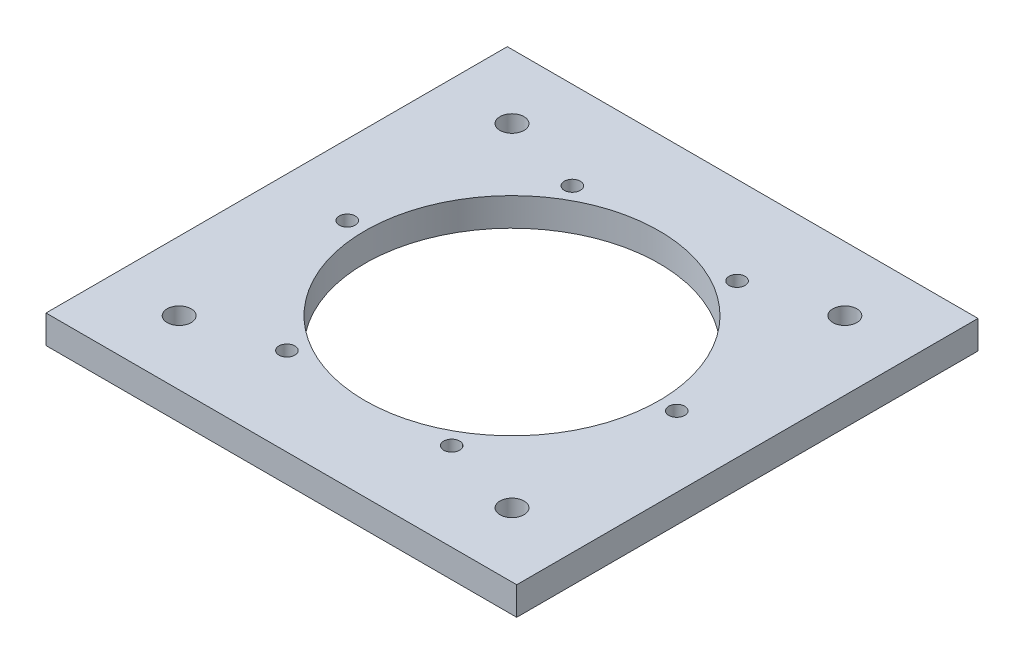
ISO-10303-21;
HEADER;
FILE_DESCRIPTION(('STEP AP214'),'2;1');
FILE_NAME('part.step','',(''),(''),'','','');
FILE_SCHEMA(('AUTOMOTIVE_DESIGN { 1 0 10303 214 1 1 1 1 }'));
ENDSEC;
DATA;
#1=APPLICATION_CONTEXT('core data for automotive mechanical design processes');
#2=APPLICATION_PROTOCOL_DEFINITION('international standard','automotive_design',2000,#1);
#3=PRODUCT_CONTEXT('',#1,'mechanical');
#4=PRODUCT('Part','Part','',(#3));
#5=PRODUCT_RELATED_PRODUCT_CATEGORY('part','',(#4));
#6=PRODUCT_DEFINITION_FORMATION('','',#4);
#7=PRODUCT_DEFINITION_CONTEXT('part definition',#1,'design');
#8=PRODUCT_DEFINITION('design','',#6,#7);
#9=PRODUCT_DEFINITION_SHAPE('','',#8);
#10=(LENGTH_UNIT() NAMED_UNIT(*) SI_UNIT(.MILLI.,.METRE.));
#11=(NAMED_UNIT(*) PLANE_ANGLE_UNIT() SI_UNIT($,.RADIAN.));
#12=(NAMED_UNIT(*) SI_UNIT($,.STERADIAN.) SOLID_ANGLE_UNIT());
#13=UNCERTAINTY_MEASURE_WITH_UNIT(LENGTH_MEASURE(1.E-05),#10,'distance_accuracy_value','');
#14=(GEOMETRIC_REPRESENTATION_CONTEXT(3) GLOBAL_UNCERTAINTY_ASSIGNED_CONTEXT((#13)) GLOBAL_UNIT_ASSIGNED_CONTEXT((#10,
#11,#12)) REPRESENTATION_CONTEXT('',''));
#15=CARTESIAN_POINT('',(0.,0.,0.));
#16=DIRECTION('',(0.,0.,1.));
#17=DIRECTION('',(1.,0.,0.));
#18=AXIS2_PLACEMENT_3D('',#15,#16,#17);
#19=CARTESIAN_POINT('',(0.,12.,0.));
#20=DIRECTION('',(0.,-1.,0.));
#21=DIRECTION('',(0.,0.,-1.));
#22=AXIS2_PLACEMENT_3D('',#19,#20,#21);
#23=PLANE('',#22);
#24=CARTESIAN_POINT('',(70.7106781186555,12.,70.710678118654));
#25=DIRECTION('',(0.,1.,0.));
#26=DIRECTION('',(0.,0.,1.));
#27=AXIS2_PLACEMENT_3D('',#24,#25,#26);
#28=CIRCLE('',#27,5.1);
#29=CARTESIAN_POINT('',(70.7106781186555,12.,75.810678118654));
#30=VERTEX_POINT('',#29);
#31=EDGE_CURVE('E20',#30,#30,#28,.F.);
#32=ORIENTED_EDGE('',*,*,#31,.T.);
#33=EDGE_LOOP('',(#32));
#34=FACE_BOUND('',#33,.T.);
#35=CARTESIAN_POINT('',(35.,12.,60.6217782649106));
#36=DIRECTION('',(0.,1.,0.));
#37=DIRECTION('',(0.,0.,1.));
#38=AXIS2_PLACEMENT_3D('',#35,#36,#37);
#39=CIRCLE('',#38,3.4);
#40=CARTESIAN_POINT('',(35.,12.,64.0217782649106));
#41=VERTEX_POINT('',#40);
#42=EDGE_CURVE('E126',#41,#41,#39,.F.);
#43=ORIENTED_EDGE('',*,*,#42,.T.);
#44=EDGE_LOOP('',(#43));
#45=FACE_BOUND('',#44,.T.);
#46=DIRECTION('',(1.,0.,0.));
#47=VECTOR('',#46,1.);
#48=CARTESIAN_POINT('',(-100.,12.,-98.));
#49=LINE('',#48,#47);
#50=CARTESIAN_POINT('',(100.,12.,-98.));
#51=VERTEX_POINT('',#50);
#52=CARTESIAN_POINT('',(-100.,12.,-98.));
#53=VERTEX_POINT('',#52);
#54=EDGE_CURVE('E370',#51,#53,#49,.F.);
#55=ORIENTED_EDGE('',*,*,#54,.T.);
#56=DIRECTION('',(0.,0.,-1.));
#57=VECTOR('',#56,1.);
#58=CARTESIAN_POINT('',(-100.,12.,98.));
#59=LINE('',#58,#57);
#60=CARTESIAN_POINT('',(-100.,12.,98.));
#61=VERTEX_POINT('',#60);
#62=EDGE_CURVE('E55',#53,#61,#59,.F.);
#63=ORIENTED_EDGE('',*,*,#62,.T.);
#64=DIRECTION('',(-1.,0.,0.));
#65=VECTOR('',#64,1.);
#66=CARTESIAN_POINT('',(-100.,12.,98.));
#67=LINE('',#66,#65);
#68=CARTESIAN_POINT('',(100.,12.,98.));
#69=VERTEX_POINT('',#68);
#70=EDGE_CURVE('E57',#61,#69,#67,.F.);
#71=ORIENTED_EDGE('',*,*,#70,.T.);
#72=DIRECTION('',(0.,0.,1.));
#73=VECTOR('',#72,1.);
#74=CARTESIAN_POINT('',(100.,12.,98.));
#75=LINE('',#74,#73);
#76=EDGE_CURVE('E60',#69,#51,#75,.F.);
#77=ORIENTED_EDGE('',*,*,#76,.T.);
#78=EDGE_LOOP('',(#55,#63,#71,#77));
#79=FACE_BOUND('',#78,.T.);
#80=CARTESIAN_POINT('',(0.,12.,0.));
#81=DIRECTION('',(0.,1.,0.));
#82=DIRECTION('',(0.,0.,1.));
#83=AXIS2_PLACEMENT_3D('',#80,#81,#82);
#84=CIRCLE('',#83,62.5);
#85=CARTESIAN_POINT('',(0.,12.,62.5));
#86=VERTEX_POINT('',#85);
#87=EDGE_CURVE('E73',#86,#86,#84,.F.);
#88=ORIENTED_EDGE('',*,*,#87,.T.);
#89=EDGE_LOOP('',(#88));
#90=FACE_BOUND('',#89,.T.);
#91=CARTESIAN_POINT('',(-70.,12.,0.));
#92=DIRECTION('',(0.,1.,0.));
#93=DIRECTION('',(0.,0.,1.));
#94=AXIS2_PLACEMENT_3D('',#91,#92,#93);
#95=CIRCLE('',#94,3.4);
#96=CARTESIAN_POINT('',(-70.,12.,3.40000000000001));
#97=VERTEX_POINT('',#96);
#98=EDGE_CURVE('E120',#97,#97,#95,.F.);
#99=ORIENTED_EDGE('',*,*,#98,.T.);
#100=EDGE_LOOP('',(#99));
#101=FACE_BOUND('',#100,.T.);
#102=CARTESIAN_POINT('',(-35.,12.,60.6217782649108));
#103=DIRECTION('',(0.,1.,0.));
#104=DIRECTION('',(0.,0.,1.));
#105=AXIS2_PLACEMENT_3D('',#102,#103,#104);
#106=CIRCLE('',#105,3.4);
#107=CARTESIAN_POINT('',(-35.,12.,64.0217782649108));
#108=VERTEX_POINT('',#107);
#109=EDGE_CURVE('E123',#108,#108,#106,.F.);
#110=ORIENTED_EDGE('',*,*,#109,.T.);
#111=EDGE_LOOP('',(#110));
#112=FACE_BOUND('',#111,.T.);
#113=CARTESIAN_POINT('',(70.,12.,0.));
#114=DIRECTION('',(0.,1.,0.));
#115=DIRECTION('',(0.,0.,1.));
#116=AXIS2_PLACEMENT_3D('',#113,#114,#115);
#117=CIRCLE('',#116,3.4);
#118=CARTESIAN_POINT('',(70.,12.,3.39999999999999));
#119=VERTEX_POINT('',#118);
#120=EDGE_CURVE('E129',#119,#119,#117,.F.);
#121=ORIENTED_EDGE('',*,*,#120,.T.);
#122=EDGE_LOOP('',(#121));
#123=FACE_BOUND('',#122,.T.);
#124=CARTESIAN_POINT('',(34.9999999999995,12.,-60.621778264911));
#125=DIRECTION('',(0.,1.,0.));
#126=DIRECTION('',(0.,0.,1.));
#127=AXIS2_PLACEMENT_3D('',#124,#125,#126);
#128=CIRCLE('',#127,3.4);
#129=CARTESIAN_POINT('',(34.9999999999995,12.,-57.221778264911));
#130=VERTEX_POINT('',#129);
#131=EDGE_CURVE('E132',#130,#130,#128,.F.);
#132=ORIENTED_EDGE('',*,*,#131,.T.);
#133=EDGE_LOOP('',(#132));
#134=FACE_BOUND('',#133,.T.);
#135=CARTESIAN_POINT('',(-35.0000000000007,12.,-60.6217782649103));
#136=DIRECTION('',(0.,1.,0.));
#137=DIRECTION('',(0.,0.,1.));
#138=AXIS2_PLACEMENT_3D('',#135,#136,#137);
#139=CIRCLE('',#138,3.4);
#140=CARTESIAN_POINT('',(-35.0000000000007,12.,-57.2217782649103));
#141=VERTEX_POINT('',#140);
#142=EDGE_CURVE('E135',#141,#141,#139,.F.);
#143=ORIENTED_EDGE('',*,*,#142,.T.);
#144=EDGE_LOOP('',(#143));
#145=FACE_BOUND('',#144,.T.);
#146=CARTESIAN_POINT('',(70.7106781186547,12.,-70.7106781186548));
#147=DIRECTION('',(0.,1.,0.));
#148=DIRECTION('',(0.,0.,1.));
#149=AXIS2_PLACEMENT_3D('',#146,#147,#148);
#150=CIRCLE('',#149,5.1);
#151=CARTESIAN_POINT('',(70.7106781186547,12.,-65.6106781186548));
#152=VERTEX_POINT('',#151);
#153=EDGE_CURVE('E138',#152,#152,#150,.F.);
#154=ORIENTED_EDGE('',*,*,#153,.T.);
#155=EDGE_LOOP('',(#154));
#156=FACE_BOUND('',#155,.T.);
#157=CARTESIAN_POINT('',(-70.710678118655,12.,-70.7106781186545));
#158=DIRECTION('',(0.,1.,0.));
#159=DIRECTION('',(0.,0.,1.));
#160=AXIS2_PLACEMENT_3D('',#157,#158,#159);
#161=CIRCLE('',#160,5.1);
#162=CARTESIAN_POINT('',(-70.710678118655,12.,-65.6106781186545));
#163=VERTEX_POINT('',#162);
#164=EDGE_CURVE('E141',#163,#163,#161,.F.);
#165=ORIENTED_EDGE('',*,*,#164,.T.);
#166=EDGE_LOOP('',(#165));
#167=FACE_BOUND('',#166,.T.);
#168=CARTESIAN_POINT('',(-70.7106781186547,12.,70.7106781186548));
#169=DIRECTION('',(0.,1.,0.));
#170=DIRECTION('',(0.,0.,1.));
#171=AXIS2_PLACEMENT_3D('',#168,#169,#170);
#172=CIRCLE('',#171,5.1);
#173=CARTESIAN_POINT('',(-70.7106781186547,12.,75.8106781186548));
#174=VERTEX_POINT('',#173);
#175=EDGE_CURVE('E143',#174,#174,#172,.F.);
#176=ORIENTED_EDGE('',*,*,#175,.T.);
#177=EDGE_LOOP('',(#176));
#178=FACE_BOUND('',#177,.T.);
#179=ADVANCED_FACE('F17',(#34,#45,#79,#90,#101,#112,#123,#134,#145,#156,#167,#178),#23,.F.);
#180=CARTESIAN_POINT('',(70.7106781186555,12.,70.710678118654));
#181=DIRECTION('',(0.,1.,0.));
#182=DIRECTION('',(0.,0.,1.));
#183=AXIS2_PLACEMENT_3D('',#180,#181,#182);
#184=CYLINDRICAL_SURFACE('',#183,5.1);
#185=CARTESIAN_POINT('',(70.7106781186555,0.,70.710678118654));
#186=DIRECTION('',(0.,1.,0.));
#187=DIRECTION('',(0.,0.,1.));
#188=AXIS2_PLACEMENT_3D('',#185,#186,#187);
#189=CIRCLE('',#188,5.1);
#190=CARTESIAN_POINT('',(70.7106781186555,0.,75.810678118654));
#191=VERTEX_POINT('',#190);
#192=EDGE_CURVE('E115',#191,#191,#189,.T.);
#193=ORIENTED_EDGE('',*,*,#192,.F.);
#194=EDGE_LOOP('',(#193));
#195=FACE_BOUND('',#194,.T.);
#196=ORIENTED_EDGE('',*,*,#31,.F.);
#197=EDGE_LOOP('',(#196));
#198=FACE_BOUND('',#197,.T.);
#199=ADVANCED_FACE('F152',(#195,#198),#184,.F.);
#200=CARTESIAN_POINT('',(-70.7106781186547,12.,70.7106781186548));
#201=DIRECTION('',(0.,1.,0.));
#202=DIRECTION('',(0.,0.,1.));
#203=AXIS2_PLACEMENT_3D('',#200,#201,#202);
#204=CYLINDRICAL_SURFACE('',#203,5.1);
#205=CARTESIAN_POINT('',(-70.7106781186547,0.,70.7106781186548));
#206=DIRECTION('',(0.,1.,0.));
#207=DIRECTION('',(0.,0.,1.));
#208=AXIS2_PLACEMENT_3D('',#205,#206,#207);
#209=CIRCLE('',#208,5.1);
#210=CARTESIAN_POINT('',(-70.7106781186547,0.,75.8106781186548));
#211=VERTEX_POINT('',#210);
#212=EDGE_CURVE('E112',#211,#211,#209,.T.);
#213=ORIENTED_EDGE('',*,*,#212,.F.);
#214=EDGE_LOOP('',(#213));
#215=FACE_BOUND('',#214,.T.);
#216=ORIENTED_EDGE('',*,*,#175,.F.);
#217=EDGE_LOOP('',(#216));
#218=FACE_BOUND('',#217,.T.);
#219=ADVANCED_FACE('F154',(#215,#218),#204,.F.);
#220=CARTESIAN_POINT('',(-70.710678118655,12.,-70.7106781186545));
#221=DIRECTION('',(0.,1.,0.));
#222=DIRECTION('',(0.,0.,1.));
#223=AXIS2_PLACEMENT_3D('',#220,#221,#222);
#224=CYLINDRICAL_SURFACE('',#223,5.1);
#225=CARTESIAN_POINT('',(-70.710678118655,0.,-70.7106781186545));
#226=DIRECTION('',(0.,1.,0.));
#227=DIRECTION('',(0.,0.,1.));
#228=AXIS2_PLACEMENT_3D('',#225,#226,#227);
#229=CIRCLE('',#228,5.1);
#230=CARTESIAN_POINT('',(-70.710678118655,0.,-65.6106781186545));
#231=VERTEX_POINT('',#230);
#232=EDGE_CURVE('E109',#231,#231,#229,.T.);
#233=ORIENTED_EDGE('',*,*,#232,.F.);
#234=EDGE_LOOP('',(#233));
#235=FACE_BOUND('',#234,.T.);
#236=ORIENTED_EDGE('',*,*,#164,.F.);
#237=EDGE_LOOP('',(#236));
#238=FACE_BOUND('',#237,.T.);
#239=ADVANCED_FACE('F162',(#235,#238),#224,.F.);
#240=CARTESIAN_POINT('',(70.7106781186547,12.,-70.7106781186548));
#241=DIRECTION('',(0.,1.,0.));
#242=DIRECTION('',(0.,0.,1.));
#243=AXIS2_PLACEMENT_3D('',#240,#241,#242);
#244=CYLINDRICAL_SURFACE('',#243,5.1);
#245=CARTESIAN_POINT('',(70.7106781186547,0.,-70.7106781186548));
#246=DIRECTION('',(0.,1.,0.));
#247=DIRECTION('',(0.,0.,1.));
#248=AXIS2_PLACEMENT_3D('',#245,#246,#247);
#249=CIRCLE('',#248,5.1);
#250=CARTESIAN_POINT('',(70.7106781186547,0.,-65.6106781186548));
#251=VERTEX_POINT('',#250);
#252=EDGE_CURVE('E106',#251,#251,#249,.T.);
#253=ORIENTED_EDGE('',*,*,#252,.F.);
#254=EDGE_LOOP('',(#253));
#255=FACE_BOUND('',#254,.T.);
#256=ORIENTED_EDGE('',*,*,#153,.F.);
#257=EDGE_LOOP('',(#256));
#258=FACE_BOUND('',#257,.T.);
#259=ADVANCED_FACE('F214',(#255,#258),#244,.F.);
#260=CARTESIAN_POINT('',(-35.0000000000007,12.,-60.6217782649103));
#261=DIRECTION('',(0.,1.,0.));
#262=DIRECTION('',(0.,0.,1.));
#263=AXIS2_PLACEMENT_3D('',#260,#261,#262);
#264=CYLINDRICAL_SURFACE('',#263,3.4);
#265=CARTESIAN_POINT('',(-35.0000000000007,0.,-60.6217782649103));
#266=DIRECTION('',(0.,1.,0.));
#267=DIRECTION('',(0.,0.,1.));
#268=AXIS2_PLACEMENT_3D('',#265,#266,#267);
#269=CIRCLE('',#268,3.4);
#270=CARTESIAN_POINT('',(-35.0000000000007,0.,-57.2217782649103));
#271=VERTEX_POINT('',#270);
#272=EDGE_CURVE('E103',#271,#271,#269,.T.);
#273=ORIENTED_EDGE('',*,*,#272,.F.);
#274=EDGE_LOOP('',(#273));
#275=FACE_BOUND('',#274,.T.);
#276=ORIENTED_EDGE('',*,*,#142,.F.);
#277=EDGE_LOOP('',(#276));
#278=FACE_BOUND('',#277,.T.);
#279=ADVANCED_FACE('F210',(#275,#278),#264,.F.);
#280=CARTESIAN_POINT('',(34.9999999999995,12.,-60.621778264911));
#281=DIRECTION('',(0.,1.,0.));
#282=DIRECTION('',(0.,0.,1.));
#283=AXIS2_PLACEMENT_3D('',#280,#281,#282);
#284=CYLINDRICAL_SURFACE('',#283,3.4);
#285=CARTESIAN_POINT('',(34.9999999999995,0.,-60.621778264911));
#286=DIRECTION('',(0.,1.,0.));
#287=DIRECTION('',(0.,0.,1.));
#288=AXIS2_PLACEMENT_3D('',#285,#286,#287);
#289=CIRCLE('',#288,3.4);
#290=CARTESIAN_POINT('',(34.9999999999995,0.,-57.221778264911));
#291=VERTEX_POINT('',#290);
#292=EDGE_CURVE('E100',#291,#291,#289,.T.);
#293=ORIENTED_EDGE('',*,*,#292,.F.);
#294=EDGE_LOOP('',(#293));
#295=FACE_BOUND('',#294,.T.);
#296=ORIENTED_EDGE('',*,*,#131,.F.);
#297=EDGE_LOOP('',(#296));
#298=FACE_BOUND('',#297,.T.);
#299=ADVANCED_FACE('F206',(#295,#298),#284,.F.);
#300=CARTESIAN_POINT('',(70.,12.,0.));
#301=DIRECTION('',(0.,1.,0.));
#302=DIRECTION('',(0.,0.,1.));
#303=AXIS2_PLACEMENT_3D('',#300,#301,#302);
#304=CYLINDRICAL_SURFACE('',#303,3.4);
#305=CARTESIAN_POINT('',(70.,0.,0.));
#306=DIRECTION('',(0.,1.,0.));
#307=DIRECTION('',(0.,0.,1.));
#308=AXIS2_PLACEMENT_3D('',#305,#306,#307);
#309=CIRCLE('',#308,3.4);
#310=CARTESIAN_POINT('',(70.,0.,3.39999999999999));
#311=VERTEX_POINT('',#310);
#312=EDGE_CURVE('E97',#311,#311,#309,.T.);
#313=ORIENTED_EDGE('',*,*,#312,.F.);
#314=EDGE_LOOP('',(#313));
#315=FACE_BOUND('',#314,.T.);
#316=ORIENTED_EDGE('',*,*,#120,.F.);
#317=EDGE_LOOP('',(#316));
#318=FACE_BOUND('',#317,.T.);
#319=ADVANCED_FACE('F202',(#315,#318),#304,.F.);
#320=CARTESIAN_POINT('',(35.,12.,60.6217782649106));
#321=DIRECTION('',(0.,1.,0.));
#322=DIRECTION('',(0.,0.,1.));
#323=AXIS2_PLACEMENT_3D('',#320,#321,#322);
#324=CYLINDRICAL_SURFACE('',#323,3.4);
#325=CARTESIAN_POINT('',(35.,0.,60.6217782649106));
#326=DIRECTION('',(0.,1.,0.));
#327=DIRECTION('',(0.,0.,1.));
#328=AXIS2_PLACEMENT_3D('',#325,#326,#327);
#329=CIRCLE('',#328,3.4);
#330=CARTESIAN_POINT('',(35.,0.,64.0217782649106));
#331=VERTEX_POINT('',#330);
#332=EDGE_CURVE('E94',#331,#331,#329,.T.);
#333=ORIENTED_EDGE('',*,*,#332,.F.);
#334=EDGE_LOOP('',(#333));
#335=FACE_BOUND('',#334,.T.);
#336=ORIENTED_EDGE('',*,*,#42,.F.);
#337=EDGE_LOOP('',(#336));
#338=FACE_BOUND('',#337,.T.);
#339=ADVANCED_FACE('F198',(#335,#338),#324,.F.);
#340=CARTESIAN_POINT('',(-35.,12.,60.6217782649108));
#341=DIRECTION('',(0.,1.,0.));
#342=DIRECTION('',(0.,0.,1.));
#343=AXIS2_PLACEMENT_3D('',#340,#341,#342);
#344=CYLINDRICAL_SURFACE('',#343,3.4);
#345=CARTESIAN_POINT('',(-35.,0.,60.6217782649108));
#346=DIRECTION('',(0.,1.,0.));
#347=DIRECTION('',(0.,0.,1.));
#348=AXIS2_PLACEMENT_3D('',#345,#346,#347);
#349=CIRCLE('',#348,3.4);
#350=CARTESIAN_POINT('',(-35.,0.,64.0217782649108));
#351=VERTEX_POINT('',#350);
#352=EDGE_CURVE('E91',#351,#351,#349,.T.);
#353=ORIENTED_EDGE('',*,*,#352,.F.);
#354=EDGE_LOOP('',(#353));
#355=FACE_BOUND('',#354,.T.);
#356=ORIENTED_EDGE('',*,*,#109,.F.);
#357=EDGE_LOOP('',(#356));
#358=FACE_BOUND('',#357,.T.);
#359=ADVANCED_FACE('F194',(#355,#358),#344,.F.);
#360=CARTESIAN_POINT('',(-70.,12.,0.));
#361=DIRECTION('',(0.,1.,0.));
#362=DIRECTION('',(0.,0.,1.));
#363=AXIS2_PLACEMENT_3D('',#360,#361,#362);
#364=CYLINDRICAL_SURFACE('',#363,3.4);
#365=CARTESIAN_POINT('',(-70.,0.,0.));
#366=DIRECTION('',(0.,1.,0.));
#367=DIRECTION('',(0.,0.,1.));
#368=AXIS2_PLACEMENT_3D('',#365,#366,#367);
#369=CIRCLE('',#368,3.4);
#370=CARTESIAN_POINT('',(-70.,0.,3.40000000000001));
#371=VERTEX_POINT('',#370);
#372=EDGE_CURVE('E88',#371,#371,#369,.T.);
#373=ORIENTED_EDGE('',*,*,#372,.F.);
#374=EDGE_LOOP('',(#373));
#375=FACE_BOUND('',#374,.T.);
#376=ORIENTED_EDGE('',*,*,#98,.F.);
#377=EDGE_LOOP('',(#376));
#378=FACE_BOUND('',#377,.T.);
#379=ADVANCED_FACE('F190',(#375,#378),#364,.F.);
#380=CARTESIAN_POINT('',(0.,0.,0.));
#381=DIRECTION('',(0.,1.,0.));
#382=DIRECTION('',(0.,0.,1.));
#383=AXIS2_PLACEMENT_3D('',#380,#381,#382);
#384=CYLINDRICAL_SURFACE('',#383,62.5);
#385=ORIENTED_EDGE('',*,*,#87,.F.);
#386=EDGE_LOOP('',(#385));
#387=FACE_BOUND('',#386,.T.);
#388=CARTESIAN_POINT('',(0.,0.,0.));
#389=DIRECTION('',(0.,1.,0.));
#390=DIRECTION('',(0.,0.,1.));
#391=AXIS2_PLACEMENT_3D('',#388,#389,#390);
#392=CIRCLE('',#391,62.5);
#393=CARTESIAN_POINT('',(0.,0.,62.5));
#394=VERTEX_POINT('',#393);
#395=EDGE_CURVE('E84',#394,#394,#392,.T.);
#396=ORIENTED_EDGE('',*,*,#395,.F.);
#397=EDGE_LOOP('',(#396));
#398=FACE_BOUND('',#397,.T.);
#399=ADVANCED_FACE('F187',(#387,#398),#384,.F.);
#400=CARTESIAN_POINT('',(100.,12.,98.));
#401=DIRECTION('',(-1.,0.,0.));
#402=DIRECTION('',(0.,0.,1.));
#403=AXIS2_PLACEMENT_3D('',#400,#401,#402);
#404=PLANE('',#403);
#405=DIRECTION('',(0.,1.,0.));
#406=VECTOR('',#405,1.);
#407=CARTESIAN_POINT('',(100.,12.,-98.));
#408=LINE('',#407,#406);
#409=CARTESIAN_POINT('',(100.,0.,-98.));
#410=VERTEX_POINT('',#409);
#411=EDGE_CURVE('E71',#410,#51,#408,.T.);
#412=ORIENTED_EDGE('',*,*,#411,.T.);
#413=ORIENTED_EDGE('',*,*,#76,.F.);
#414=DIRECTION('',(0.,1.,0.));
#415=VECTOR('',#414,1.);
#416=CARTESIAN_POINT('',(100.,12.,98.));
#417=LINE('',#416,#415);
#418=CARTESIAN_POINT('',(100.,0.,98.));
#419=VERTEX_POINT('',#418);
#420=EDGE_CURVE('E65',#69,#419,#417,.F.);
#421=ORIENTED_EDGE('',*,*,#420,.T.);
#422=DIRECTION('',(0.,0.,-1.));
#423=VECTOR('',#422,1.);
#424=CARTESIAN_POINT('',(100.,0.,0.));
#425=LINE('',#424,#423);
#426=EDGE_CURVE('E87',#410,#419,#425,.F.);
#427=ORIENTED_EDGE('',*,*,#426,.F.);
#428=EDGE_LOOP('',(#412,#413,#421,#427));
#429=FACE_BOUND('',#428,.T.);
#430=ADVANCED_FACE('F68',(#429),#404,.F.);
#431=CARTESIAN_POINT('',(-100.,12.,98.));
#432=DIRECTION('',(0.,0.,-1.));
#433=DIRECTION('',(-1.,0.,0.));
#434=AXIS2_PLACEMENT_3D('',#431,#432,#433);
#435=PLANE('',#434);
#436=ORIENTED_EDGE('',*,*,#420,.F.);
#437=ORIENTED_EDGE('',*,*,#70,.F.);
#438=DIRECTION('',(0.,1.,0.));
#439=VECTOR('',#438,1.);
#440=CARTESIAN_POINT('',(-100.,12.,98.));
#441=LINE('',#440,#439);
#442=CARTESIAN_POINT('',(-100.,0.,98.));
#443=VERTEX_POINT('',#442);
#444=EDGE_CURVE('E80',#61,#443,#441,.F.);
#445=ORIENTED_EDGE('',*,*,#444,.T.);
#446=DIRECTION('',(1.,0.,0.));
#447=VECTOR('',#446,1.);
#448=CARTESIAN_POINT('',(0.,0.,98.));
#449=LINE('',#448,#447);
#450=EDGE_CURVE('E77',#419,#443,#449,.F.);
#451=ORIENTED_EDGE('',*,*,#450,.F.);
#452=EDGE_LOOP('',(#436,#437,#445,#451));
#453=FACE_BOUND('',#452,.T.);
#454=ADVANCED_FACE('F75',(#453),#435,.F.);
#455=CARTESIAN_POINT('',(-100.,12.,98.));
#456=DIRECTION('',(1.,0.,0.));
#457=DIRECTION('',(0.,0.,-1.));
#458=AXIS2_PLACEMENT_3D('',#455,#456,#457);
#459=PLANE('',#458);
#460=ORIENTED_EDGE('',*,*,#444,.F.);
#461=ORIENTED_EDGE('',*,*,#62,.F.);
#462=DIRECTION('',(0.,1.,0.));
#463=VECTOR('',#462,1.);
#464=CARTESIAN_POINT('',(-100.,12.,-98.));
#465=LINE('',#464,#463);
#466=CARTESIAN_POINT('',(-100.,0.,-98.));
#467=VERTEX_POINT('',#466);
#468=EDGE_CURVE('E35',#53,#467,#465,.F.);
#469=ORIENTED_EDGE('',*,*,#468,.T.);
#470=DIRECTION('',(0.,0.,-1.));
#471=VECTOR('',#470,1.);
#472=CARTESIAN_POINT('',(-100.,0.,0.));
#473=LINE('',#472,#471);
#474=EDGE_CURVE('E26',#443,#467,#473,.T.);
#475=ORIENTED_EDGE('',*,*,#474,.F.);
#476=EDGE_LOOP('',(#460,#461,#469,#475));
#477=FACE_BOUND('',#476,.T.);
#478=ADVANCED_FACE('F175',(#477),#459,.F.);
#479=CARTESIAN_POINT('',(-100.,12.,-98.));
#480=DIRECTION('',(0.,0.,1.));
#481=DIRECTION('',(1.,0.,0.));
#482=AXIS2_PLACEMENT_3D('',#479,#480,#481);
#483=PLANE('',#482);
#484=ORIENTED_EDGE('',*,*,#468,.F.);
#485=ORIENTED_EDGE('',*,*,#54,.F.);
#486=ORIENTED_EDGE('',*,*,#411,.F.);
#487=DIRECTION('',(1.,0.,0.));
#488=VECTOR('',#487,1.);
#489=CARTESIAN_POINT('',(0.,0.,-98.));
#490=LINE('',#489,#488);
#491=EDGE_CURVE('E11',#467,#410,#490,.T.);
#492=ORIENTED_EDGE('',*,*,#491,.F.);
#493=EDGE_LOOP('',(#484,#485,#486,#492));
#494=FACE_BOUND('',#493,.T.);
#495=ADVANCED_FACE('F168',(#494),#483,.F.);
#496=CARTESIAN_POINT('',(0.,0.,0.));
#497=DIRECTION('',(0.,-1.,0.));
#498=DIRECTION('',(0.,0.,-1.));
#499=AXIS2_PLACEMENT_3D('',#496,#497,#498);
#500=PLANE('',#499);
#501=ORIENTED_EDGE('',*,*,#474,.T.);
#502=ORIENTED_EDGE('',*,*,#491,.T.);
#503=ORIENTED_EDGE('',*,*,#426,.T.);
#504=ORIENTED_EDGE('',*,*,#450,.T.);
#505=EDGE_LOOP('',(#501,#502,#503,#504));
#506=FACE_BOUND('',#505,.T.);
#507=ORIENTED_EDGE('',*,*,#395,.T.);
#508=EDGE_LOOP('',(#507));
#509=FACE_BOUND('',#508,.T.);
#510=ORIENTED_EDGE('',*,*,#372,.T.);
#511=EDGE_LOOP('',(#510));
#512=FACE_BOUND('',#511,.T.);
#513=ORIENTED_EDGE('',*,*,#352,.T.);
#514=EDGE_LOOP('',(#513));
#515=FACE_BOUND('',#514,.T.);
#516=ORIENTED_EDGE('',*,*,#332,.T.);
#517=EDGE_LOOP('',(#516));
#518=FACE_BOUND('',#517,.T.);
#519=ORIENTED_EDGE('',*,*,#312,.T.);
#520=EDGE_LOOP('',(#519));
#521=FACE_BOUND('',#520,.T.);
#522=ORIENTED_EDGE('',*,*,#292,.T.);
#523=EDGE_LOOP('',(#522));
#524=FACE_BOUND('',#523,.T.);
#525=ORIENTED_EDGE('',*,*,#272,.T.);
#526=EDGE_LOOP('',(#525));
#527=FACE_BOUND('',#526,.T.);
#528=ORIENTED_EDGE('',*,*,#252,.T.);
#529=EDGE_LOOP('',(#528));
#530=FACE_BOUND('',#529,.T.);
#531=ORIENTED_EDGE('',*,*,#232,.T.);
#532=EDGE_LOOP('',(#531));
#533=FACE_BOUND('',#532,.T.);
#534=ORIENTED_EDGE('',*,*,#212,.T.);
#535=EDGE_LOOP('',(#534));
#536=FACE_BOUND('',#535,.T.);
#537=ORIENTED_EDGE('',*,*,#192,.T.);
#538=EDGE_LOOP('',(#537));
#539=FACE_BOUND('',#538,.T.);
#540=ADVANCED_FACE('F166',(#506,#509,#512,#515,#518,#521,#524,#527,#530,#533,#536,#539),#500,.T.);
#541=CLOSED_SHELL('',(#179,#199,#219,#239,#259,#279,#299,#319,#339,#359,#379,#399,#430,#454,
#478,#495,#540));
#542=MANIFOLD_SOLID_BREP('B1',#541);
#543=ADVANCED_BREP_SHAPE_REPRESENTATION('',(#18,#542),#14);
#544=SHAPE_DEFINITION_REPRESENTATION(#9,#543);
ENDSEC;
END-ISO-10303-21;
